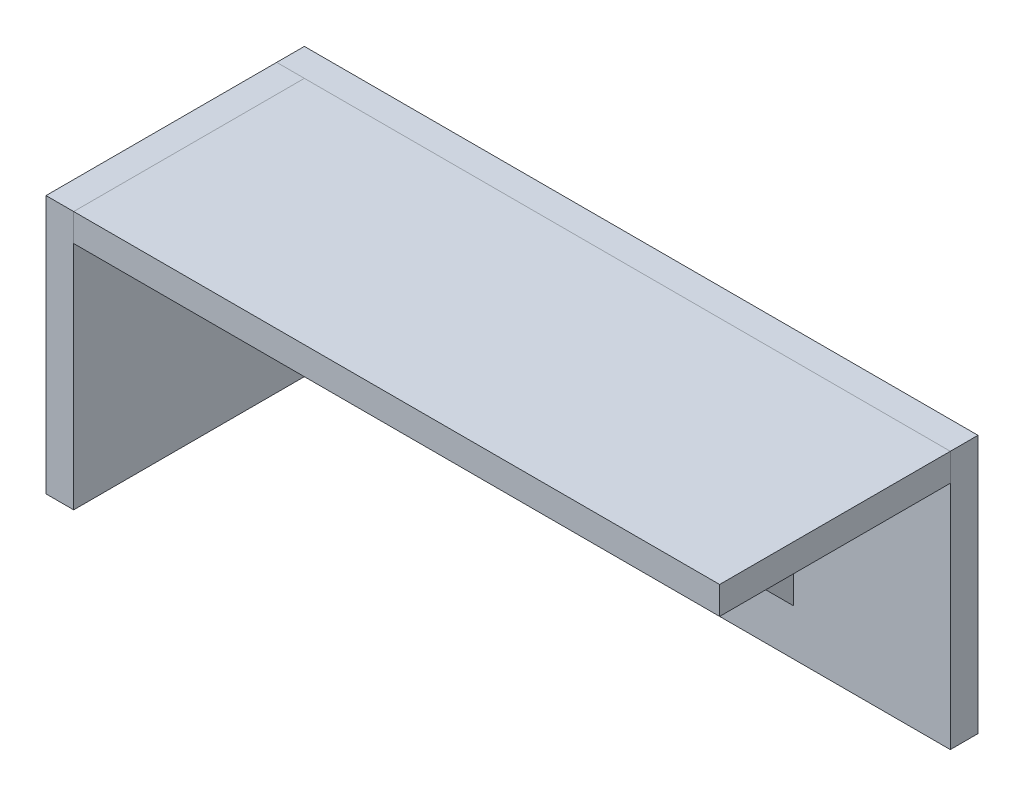
ISO-10303-21;
HEADER;
FILE_DESCRIPTION(('STEP AP214'),'2;1');
FILE_NAME('part.step','',(''),(''),'','','');
FILE_SCHEMA(('AUTOMOTIVE_DESIGN { 1 0 10303 214 1 1 1 1 }'));
ENDSEC;
DATA;
#1=APPLICATION_CONTEXT('core data for automotive mechanical design processes');
#2=APPLICATION_PROTOCOL_DEFINITION('international standard','automotive_design',2000,#1);
#3=PRODUCT_CONTEXT('',#1,'mechanical');
#4=PRODUCT('Part','Part','',(#3));
#5=PRODUCT_RELATED_PRODUCT_CATEGORY('part','',(#4));
#6=PRODUCT_DEFINITION_FORMATION('','',#4);
#7=PRODUCT_DEFINITION_CONTEXT('part definition',#1,'design');
#8=PRODUCT_DEFINITION('design','',#6,#7);
#9=PRODUCT_DEFINITION_SHAPE('','',#8);
#10=(LENGTH_UNIT() NAMED_UNIT(*) SI_UNIT(.MILLI.,.METRE.));
#11=(NAMED_UNIT(*) PLANE_ANGLE_UNIT() SI_UNIT($,.RADIAN.));
#12=(NAMED_UNIT(*) SI_UNIT($,.STERADIAN.) SOLID_ANGLE_UNIT());
#13=UNCERTAINTY_MEASURE_WITH_UNIT(LENGTH_MEASURE(1.E-05),#10,'distance_accuracy_value','');
#14=(GEOMETRIC_REPRESENTATION_CONTEXT(3) GLOBAL_UNCERTAINTY_ASSIGNED_CONTEXT((#13)) GLOBAL_UNIT_ASSIGNED_CONTEXT((#10,
#11,#12)) REPRESENTATION_CONTEXT('',''));
#15=CARTESIAN_POINT('',(0.,0.,0.));
#16=DIRECTION('',(0.,0.,1.));
#17=DIRECTION('',(1.,0.,0.));
#18=AXIS2_PLACEMENT_3D('',#15,#16,#17);
#19=CARTESIAN_POINT('',(-0.499999999999989,13.5,0.));
#20=DIRECTION('',(0.,-1.,0.));
#21=DIRECTION('',(0.,0.,-1.));
#22=AXIS2_PLACEMENT_3D('',#19,#20,#21);
#23=PLANE('',#22);
#24=DIRECTION('',(0.,0.,1.));
#25=VECTOR('',#24,1.);
#26=CARTESIAN_POINT('',(-3.49999999999999,13.5,0.));
#27=LINE('',#26,#25);
#28=CARTESIAN_POINT('',(-3.49999999999999,13.5,0.));
#29=VERTEX_POINT('',#28);
#30=CARTESIAN_POINT('',(-3.49999999999999,13.5,20.));
#31=VERTEX_POINT('',#30);
#32=EDGE_CURVE('E100',#29,#31,#27,.T.);
#33=ORIENTED_EDGE('',*,*,#32,.T.);
#34=DIRECTION('',(-1.,0.,0.));
#35=VECTOR('',#34,1.);
#36=CARTESIAN_POINT('',(-0.499999999999989,13.5,20.));
#37=LINE('',#36,#35);
#38=CARTESIAN_POINT('',(-0.499999999999989,13.5,20.));
#39=VERTEX_POINT('',#38);
#40=EDGE_CURVE('E12',#39,#31,#37,.T.);
#41=ORIENTED_EDGE('',*,*,#40,.F.);
#42=DIRECTION('',(0.,0.,1.));
#43=VECTOR('',#42,1.);
#44=CARTESIAN_POINT('',(-0.499999999999989,13.5,0.));
#45=LINE('',#44,#43);
#46=CARTESIAN_POINT('',(-0.499999999999989,13.5,0.));
#47=VERTEX_POINT('',#46);
#48=EDGE_CURVE('E93',#47,#39,#45,.T.);
#49=ORIENTED_EDGE('',*,*,#48,.F.);
#50=DIRECTION('',(-1.,0.,0.));
#51=VECTOR('',#50,1.);
#52=CARTESIAN_POINT('',(-0.499999999999989,13.5,0.));
#53=LINE('',#52,#51);
#54=EDGE_CURVE('E101',#47,#29,#53,.T.);
#55=ORIENTED_EDGE('',*,*,#54,.T.);
#56=EDGE_LOOP('',(#33,#41,#49,#55));
#57=FACE_BOUND('',#56,.T.);
#58=ADVANCED_FACE('F53',(#57),#23,.F.);
#59=CARTESIAN_POINT('',(-0.499999999999989,13.5,20.));
#60=DIRECTION('',(0.,0.707106781186547,-0.707106781186548));
#61=DIRECTION('',(0.,0.707106781186548,0.707106781186547));
#62=AXIS2_PLACEMENT_3D('',#59,#60,#61);
#63=PLANE('',#62);
#64=DIRECTION('',(0.,-0.707106781186548,-0.707106781186547));
#65=VECTOR('',#64,1.);
#66=CARTESIAN_POINT('',(-3.49999999999999,13.5,20.));
#67=LINE('',#66,#65);
#68=CARTESIAN_POINT('',(-3.49999999999999,-6.5,0.));
#69=VERTEX_POINT('',#68);
#70=EDGE_CURVE('E81',#31,#69,#67,.T.);
#71=ORIENTED_EDGE('',*,*,#70,.T.);
#72=DIRECTION('',(-1.,0.,0.));
#73=VECTOR('',#72,1.);
#74=CARTESIAN_POINT('',(-0.499999999999989,-6.5,0.));
#75=LINE('',#74,#73);
#76=CARTESIAN_POINT('',(-0.499999999999989,-6.5,0.));
#77=VERTEX_POINT('',#76);
#78=EDGE_CURVE('E61',#77,#69,#75,.T.);
#79=ORIENTED_EDGE('',*,*,#78,.F.);
#80=DIRECTION('',(0.,-0.707106781186548,-0.707106781186547));
#81=VECTOR('',#80,1.);
#82=CARTESIAN_POINT('',(-0.499999999999989,13.5,20.));
#83=LINE('',#82,#81);
#84=EDGE_CURVE('E89',#39,#77,#83,.T.);
#85=ORIENTED_EDGE('',*,*,#84,.F.);
#86=ORIENTED_EDGE('',*,*,#40,.T.);
#87=EDGE_LOOP('',(#71,#79,#85,#86));
#88=FACE_BOUND('',#87,.T.);
#89=ADVANCED_FACE('F90',(#88),#63,.F.);
#90=CARTESIAN_POINT('',(-0.499999999999989,-6.5,0.));
#91=DIRECTION('',(0.,0.,1.));
#92=DIRECTION('',(0.,-1.,0.));
#93=AXIS2_PLACEMENT_3D('',#90,#91,#92);
#94=PLANE('',#93);
#95=DIRECTION('',(0.,1.,0.));
#96=VECTOR('',#95,1.);
#97=CARTESIAN_POINT('',(-3.49999999999999,-6.5,0.));
#98=LINE('',#97,#96);
#99=EDGE_CURVE('E86',#69,#29,#98,.T.);
#100=ORIENTED_EDGE('',*,*,#99,.T.);
#101=ORIENTED_EDGE('',*,*,#54,.F.);
#102=DIRECTION('',(0.,1.,0.));
#103=VECTOR('',#102,1.);
#104=CARTESIAN_POINT('',(-0.499999999999989,-6.5,0.));
#105=LINE('',#104,#103);
#106=EDGE_CURVE('E69',#77,#47,#105,.T.);
#107=ORIENTED_EDGE('',*,*,#106,.F.);
#108=ORIENTED_EDGE('',*,*,#78,.T.);
#109=EDGE_LOOP('',(#100,#101,#107,#108));
#110=FACE_BOUND('',#109,.T.);
#111=ADVANCED_FACE('F108',(#110),#94,.F.);
#112=CARTESIAN_POINT('',(-0.499999999999989,0.,0.));
#113=DIRECTION('',(-1.,0.,0.));
#114=DIRECTION('',(0.,0.,1.));
#115=AXIS2_PLACEMENT_3D('',#112,#113,#114);
#116=PLANE('',#115);
#117=ORIENTED_EDGE('',*,*,#48,.T.);
#118=ORIENTED_EDGE('',*,*,#84,.T.);
#119=ORIENTED_EDGE('',*,*,#106,.T.);
#120=EDGE_LOOP('',(#117,#118,#119));
#121=FACE_BOUND('',#120,.T.);
#122=ADVANCED_FACE('F96',(#121),#116,.F.);
#123=CARTESIAN_POINT('',(-3.49999999999999,0.,0.));
#124=DIRECTION('',(-1.,0.,0.));
#125=DIRECTION('',(0.,0.,1.));
#126=AXIS2_PLACEMENT_3D('',#123,#124,#125);
#127=PLANE('',#126);
#128=ORIENTED_EDGE('',*,*,#32,.F.);
#129=ORIENTED_EDGE('',*,*,#99,.F.);
#130=ORIENTED_EDGE('',*,*,#70,.F.);
#131=EDGE_LOOP('',(#128,#129,#130));
#132=FACE_BOUND('',#131,.T.);
#133=ADVANCED_FACE('F109',(#132),#127,.T.);
#134=CLOSED_SHELL('',(#58,#89,#111,#122,#133));
#135=MANIFOLD_SOLID_BREP('B2',#134);
#136=CARTESIAN_POINT('',(-30.5,13.5,0.));
#137=DIRECTION('',(0.,-1.,0.));
#138=DIRECTION('',(0.,0.,-1.));
#139=AXIS2_PLACEMENT_3D('',#136,#137,#138);
#140=PLANE('',#139);
#141=DIRECTION('',(0.,0.,1.));
#142=VECTOR('',#141,1.);
#143=CARTESIAN_POINT('',(-33.5,13.5,0.));
#144=LINE('',#143,#142);
#145=CARTESIAN_POINT('',(-33.5,13.5,0.));
#146=VERTEX_POINT('',#145);
#147=CARTESIAN_POINT('',(-33.5,13.5,20.));
#148=VERTEX_POINT('',#147);
#149=EDGE_CURVE('E213',#146,#148,#144,.T.);
#150=ORIENTED_EDGE('',*,*,#149,.T.);
#151=DIRECTION('',(-1.,0.,0.));
#152=VECTOR('',#151,1.);
#153=CARTESIAN_POINT('',(-30.5,13.5,20.));
#154=LINE('',#153,#152);
#155=CARTESIAN_POINT('',(-30.5,13.5,20.));
#156=VERTEX_POINT('',#155);
#157=EDGE_CURVE('E51',#156,#148,#154,.T.);
#158=ORIENTED_EDGE('',*,*,#157,.F.);
#159=DIRECTION('',(0.,0.,1.));
#160=VECTOR('',#159,1.);
#161=CARTESIAN_POINT('',(-30.5,13.5,0.));
#162=LINE('',#161,#160);
#163=CARTESIAN_POINT('',(-30.5,13.5,0.));
#164=VERTEX_POINT('',#163);
#165=EDGE_CURVE('E205',#164,#156,#162,.T.);
#166=ORIENTED_EDGE('',*,*,#165,.F.);
#167=DIRECTION('',(-1.,0.,0.));
#168=VECTOR('',#167,1.);
#169=CARTESIAN_POINT('',(-30.5,13.5,0.));
#170=LINE('',#169,#168);
#171=EDGE_CURVE('E214',#164,#146,#170,.T.);
#172=ORIENTED_EDGE('',*,*,#171,.T.);
#173=EDGE_LOOP('',(#150,#158,#166,#172));
#174=FACE_BOUND('',#173,.T.);
#175=ADVANCED_FACE('F164',(#174),#140,.F.);
#176=CARTESIAN_POINT('',(-30.5,13.5,20.));
#177=DIRECTION('',(0.,0.707106781186547,-0.707106781186548));
#178=DIRECTION('',(0.,0.707106781186548,0.707106781186547));
#179=AXIS2_PLACEMENT_3D('',#176,#177,#178);
#180=PLANE('',#179);
#181=DIRECTION('',(0.,-0.707106781186548,-0.707106781186547));
#182=VECTOR('',#181,1.);
#183=CARTESIAN_POINT('',(-33.5,13.5,20.));
#184=LINE('',#183,#182);
#185=CARTESIAN_POINT('',(-33.5,-6.5,0.));
#186=VERTEX_POINT('',#185);
#187=EDGE_CURVE('E192',#148,#186,#184,.T.);
#188=ORIENTED_EDGE('',*,*,#187,.T.);
#189=DIRECTION('',(-1.,0.,0.));
#190=VECTOR('',#189,1.);
#191=CARTESIAN_POINT('',(-30.5,-6.5,0.));
#192=LINE('',#191,#190);
#193=CARTESIAN_POINT('',(-30.5,-6.5,0.));
#194=VERTEX_POINT('',#193);
#195=EDGE_CURVE('E172',#194,#186,#192,.T.);
#196=ORIENTED_EDGE('',*,*,#195,.F.);
#197=DIRECTION('',(0.,-0.707106781186548,-0.707106781186547));
#198=VECTOR('',#197,1.);
#199=CARTESIAN_POINT('',(-30.5,13.5,20.));
#200=LINE('',#199,#198);
#201=EDGE_CURVE('E200',#156,#194,#200,.T.);
#202=ORIENTED_EDGE('',*,*,#201,.F.);
#203=ORIENTED_EDGE('',*,*,#157,.T.);
#204=EDGE_LOOP('',(#188,#196,#202,#203));
#205=FACE_BOUND('',#204,.T.);
#206=ADVANCED_FACE('F201',(#205),#180,.F.);
#207=CARTESIAN_POINT('',(-30.5,-6.5,0.));
#208=DIRECTION('',(0.,0.,1.));
#209=DIRECTION('',(0.,-1.,0.));
#210=AXIS2_PLACEMENT_3D('',#207,#208,#209);
#211=PLANE('',#210);
#212=DIRECTION('',(0.,1.,0.));
#213=VECTOR('',#212,1.);
#214=CARTESIAN_POINT('',(-33.5,-6.5,0.));
#215=LINE('',#214,#213);
#216=EDGE_CURVE('E197',#186,#146,#215,.T.);
#217=ORIENTED_EDGE('',*,*,#216,.T.);
#218=ORIENTED_EDGE('',*,*,#171,.F.);
#219=DIRECTION('',(0.,1.,0.));
#220=VECTOR('',#219,1.);
#221=CARTESIAN_POINT('',(-30.5,-6.5,0.));
#222=LINE('',#221,#220);
#223=EDGE_CURVE('E180',#194,#164,#222,.T.);
#224=ORIENTED_EDGE('',*,*,#223,.F.);
#225=ORIENTED_EDGE('',*,*,#195,.T.);
#226=EDGE_LOOP('',(#217,#218,#224,#225));
#227=FACE_BOUND('',#226,.T.);
#228=ADVANCED_FACE('F221',(#227),#211,.F.);
#229=CARTESIAN_POINT('',(-30.5,0.,0.));
#230=DIRECTION('',(-1.,0.,0.));
#231=DIRECTION('',(0.,0.,1.));
#232=AXIS2_PLACEMENT_3D('',#229,#230,#231);
#233=PLANE('',#232);
#234=ORIENTED_EDGE('',*,*,#165,.T.);
#235=ORIENTED_EDGE('',*,*,#201,.T.);
#236=ORIENTED_EDGE('',*,*,#223,.T.);
#237=EDGE_LOOP('',(#234,#235,#236));
#238=FACE_BOUND('',#237,.T.);
#239=ADVANCED_FACE('F208',(#238),#233,.F.);
#240=CARTESIAN_POINT('',(-33.5,0.,0.));
#241=DIRECTION('',(-1.,0.,0.));
#242=DIRECTION('',(0.,0.,1.));
#243=AXIS2_PLACEMENT_3D('',#240,#241,#242);
#244=PLANE('',#243);
#245=ORIENTED_EDGE('',*,*,#149,.F.);
#246=ORIENTED_EDGE('',*,*,#216,.F.);
#247=ORIENTED_EDGE('',*,*,#187,.F.);
#248=EDGE_LOOP('',(#245,#246,#247));
#249=FACE_BOUND('',#248,.T.);
#250=ADVANCED_FACE('F222',(#249),#244,.T.);
#251=CLOSED_SHELL('',(#175,#206,#228,#239,#250));
#252=MANIFOLD_SOLID_BREP('B6',#251);
#253=CARTESIAN_POINT('',(-53.5,16.5,25.));
#254=DIRECTION('',(0.,0.,-1.));
#255=DIRECTION('',(0.,1.,0.));
#256=AXIS2_PLACEMENT_3D('',#253,#254,#255);
#257=PLANE('',#256);
#258=DIRECTION('',(0.,-1.,0.));
#259=VECTOR('',#258,1.);
#260=CARTESIAN_POINT('',(-56.5,16.5,25.));
#261=LINE('',#260,#259);
#262=CARTESIAN_POINT('',(-56.5,16.5,25.));
#263=VERTEX_POINT('',#262);
#264=CARTESIAN_POINT('',(-56.5,-11.5,25.));
#265=VERTEX_POINT('',#264);
#266=EDGE_CURVE('E344',#263,#265,#261,.T.);
#267=ORIENTED_EDGE('',*,*,#266,.T.);
#268=DIRECTION('',(-1.,0.,0.));
#269=VECTOR('',#268,1.);
#270=CARTESIAN_POINT('',(-53.5,-11.5,25.));
#271=LINE('',#270,#269);
#272=CARTESIAN_POINT('',(-53.5,-11.5,25.));
#273=VERTEX_POINT('',#272);
#274=EDGE_CURVE('E162',#273,#265,#271,.T.);
#275=ORIENTED_EDGE('',*,*,#274,.F.);
#276=DIRECTION('',(0.,-1.,0.));
#277=VECTOR('',#276,1.);
#278=CARTESIAN_POINT('',(-53.5,16.5,25.));
#279=LINE('',#278,#277);
#280=CARTESIAN_POINT('',(-53.5,16.5,25.));
#281=VERTEX_POINT('',#280);
#282=EDGE_CURVE('E332',#281,#273,#279,.T.);
#283=ORIENTED_EDGE('',*,*,#282,.F.);
#284=DIRECTION('',(-1.,0.,0.));
#285=VECTOR('',#284,1.);
#286=CARTESIAN_POINT('',(-53.5,16.5,25.));
#287=LINE('',#286,#285);
#288=EDGE_CURVE('E340',#281,#263,#287,.T.);
#289=ORIENTED_EDGE('',*,*,#288,.T.);
#290=EDGE_LOOP('',(#267,#275,#283,#289));
#291=FACE_BOUND('',#290,.T.);
#292=ADVANCED_FACE('F281',(#291),#257,.F.);
#293=CARTESIAN_POINT('',(-53.5,-11.5,-3.));
#294=DIRECTION('',(0.,1.,0.));
#295=DIRECTION('',(-1.,0.,0.));
#296=AXIS2_PLACEMENT_3D('',#293,#294,#295);
#297=PLANE('',#296);
#298=DIRECTION('',(0.,0.,-1.));
#299=VECTOR('',#298,1.);
#300=CARTESIAN_POINT('',(-56.5,-11.5,-3.));
#301=LINE('',#300,#299);
#302=CARTESIAN_POINT('',(-56.5,-11.5,0.));
#303=VERTEX_POINT('',#302);
#304=EDGE_CURVE('E336',#265,#303,#301,.T.);
#305=ORIENTED_EDGE('',*,*,#304,.T.);
#306=DIRECTION('',(-1.,0.,0.));
#307=VECTOR('',#306,1.);
#308=CARTESIAN_POINT('',(-53.5,-11.5,0.));
#309=LINE('',#308,#307);
#310=CARTESIAN_POINT('',(-53.5,-11.5,0.));
#311=VERTEX_POINT('',#310);
#312=EDGE_CURVE('E289',#311,#303,#309,.T.);
#313=ORIENTED_EDGE('',*,*,#312,.F.);
#314=DIRECTION('',(0.,0.,-1.));
#315=VECTOR('',#314,1.);
#316=CARTESIAN_POINT('',(-53.5,-11.5,-3.));
#317=LINE('',#316,#315);
#318=EDGE_CURVE('E327',#273,#311,#317,.T.);
#319=ORIENTED_EDGE('',*,*,#318,.F.);
#320=ORIENTED_EDGE('',*,*,#274,.T.);
#321=EDGE_LOOP('',(#305,#313,#319,#320));
#322=FACE_BOUND('',#321,.T.);
#323=ADVANCED_FACE('F335',(#322),#297,.F.);
#324=CARTESIAN_POINT('',(-53.5,16.5,0.));
#325=DIRECTION('',(0.,0.,1.));
#326=DIRECTION('',(0.,-1.,0.));
#327=AXIS2_PLACEMENT_3D('',#324,#325,#326);
#328=PLANE('',#327);
#329=DIRECTION('',(0.,1.,0.));
#330=VECTOR('',#329,1.);
#331=CARTESIAN_POINT('',(-56.5,16.5,0.));
#332=LINE('',#331,#330);
#333=CARTESIAN_POINT('',(-56.5,16.5,0.));
#334=VERTEX_POINT('',#333);
#335=EDGE_CURVE('E314',#303,#334,#332,.T.);
#336=ORIENTED_EDGE('',*,*,#335,.T.);
#337=DIRECTION('',(-1.,0.,0.));
#338=VECTOR('',#337,1.);
#339=CARTESIAN_POINT('',(-53.5,16.5,0.));
#340=LINE('',#339,#338);
#341=CARTESIAN_POINT('',(-53.5,16.5,0.));
#342=VERTEX_POINT('',#341);
#343=EDGE_CURVE('E337',#342,#334,#340,.T.);
#344=ORIENTED_EDGE('',*,*,#343,.F.);
#345=DIRECTION('',(0.,1.,0.));
#346=VECTOR('',#345,1.);
#347=CARTESIAN_POINT('',(-53.5,16.5,0.));
#348=LINE('',#347,#346);
#349=EDGE_CURVE('E330',#311,#342,#348,.T.);
#350=ORIENTED_EDGE('',*,*,#349,.F.);
#351=ORIENTED_EDGE('',*,*,#312,.T.);
#352=EDGE_LOOP('',(#336,#344,#350,#351));
#353=FACE_BOUND('',#352,.T.);
#354=ADVANCED_FACE('F338',(#353),#328,.F.);
#355=CARTESIAN_POINT('',(-53.5,16.5,-3.));
#356=DIRECTION('',(0.,-1.,0.));
#357=DIRECTION('',(1.,0.,0.));
#358=AXIS2_PLACEMENT_3D('',#355,#356,#357);
#359=PLANE('',#358);
#360=DIRECTION('',(0.,0.,1.));
#361=VECTOR('',#360,1.);
#362=CARTESIAN_POINT('',(-56.5,16.5,-3.));
#363=LINE('',#362,#361);
#364=EDGE_CURVE('E320',#334,#263,#363,.T.);
#365=ORIENTED_EDGE('',*,*,#364,.T.);
#366=ORIENTED_EDGE('',*,*,#288,.F.);
#367=DIRECTION('',(0.,0.,1.));
#368=VECTOR('',#367,1.);
#369=CARTESIAN_POINT('',(-53.5,16.5,-3.));
#370=LINE('',#369,#368);
#371=EDGE_CURVE('E297',#342,#281,#370,.T.);
#372=ORIENTED_EDGE('',*,*,#371,.F.);
#373=ORIENTED_EDGE('',*,*,#343,.T.);
#374=EDGE_LOOP('',(#365,#366,#372,#373));
#375=FACE_BOUND('',#374,.T.);
#376=ADVANCED_FACE('F358',(#375),#359,.F.);
#377=CARTESIAN_POINT('',(-53.5,0.,0.));
#378=DIRECTION('',(1.,0.,0.));
#379=DIRECTION('',(0.,0.,-1.));
#380=AXIS2_PLACEMENT_3D('',#377,#378,#379);
#381=PLANE('',#380);
#382=ORIENTED_EDGE('',*,*,#282,.T.);
#383=ORIENTED_EDGE('',*,*,#318,.T.);
#384=ORIENTED_EDGE('',*,*,#349,.T.);
#385=ORIENTED_EDGE('',*,*,#371,.T.);
#386=EDGE_LOOP('',(#382,#383,#384,#385));
#387=FACE_BOUND('',#386,.T.);
#388=ADVANCED_FACE('F328',(#387),#381,.T.);
#389=CARTESIAN_POINT('',(-56.5,0.,0.));
#390=DIRECTION('',(1.,0.,0.));
#391=DIRECTION('',(0.,0.,-1.));
#392=AXIS2_PLACEMENT_3D('',#389,#390,#391);
#393=PLANE('',#392);
#394=ORIENTED_EDGE('',*,*,#266,.F.);
#395=ORIENTED_EDGE('',*,*,#364,.F.);
#396=ORIENTED_EDGE('',*,*,#335,.F.);
#397=ORIENTED_EDGE('',*,*,#304,.F.);
#398=EDGE_LOOP('',(#394,#395,#396,#397));
#399=FACE_BOUND('',#398,.T.);
#400=ADVANCED_FACE('F361',(#399),#393,.F.);
#401=CLOSED_SHELL('',(#292,#323,#354,#376,#388,#400));
#402=MANIFOLD_SOLID_BREP('B45',#401);
#403=CARTESIAN_POINT('',(-53.5,13.5,0.));
#404=DIRECTION('',(-1.,0.,0.));
#405=DIRECTION('',(0.,-1.,0.));
#406=AXIS2_PLACEMENT_3D('',#403,#404,#405);
#407=PLANE('',#406);
#408=DIRECTION('',(0.,0.,1.));
#409=VECTOR('',#408,1.);
#410=CARTESIAN_POINT('',(-53.5,16.5,0.));
#411=LINE('',#410,#409);
#412=CARTESIAN_POINT('',(-53.5,16.5,0.));
#413=VERTEX_POINT('',#412);
#414=CARTESIAN_POINT('',(-53.5,16.5,25.));
#415=VERTEX_POINT('',#414);
#416=EDGE_CURVE('E489',#413,#415,#411,.T.);
#417=ORIENTED_EDGE('',*,*,#416,.F.);
#418=DIRECTION('',(0.,1.,0.));
#419=VECTOR('',#418,1.);
#420=CARTESIAN_POINT('',(-53.5,13.5,0.));
#421=LINE('',#420,#419);
#422=CARTESIAN_POINT('',(-53.5,13.5,0.));
#423=VERTEX_POINT('',#422);
#424=EDGE_CURVE('E279',#423,#413,#421,.T.);
#425=ORIENTED_EDGE('',*,*,#424,.F.);
#426=DIRECTION('',(0.,0.,1.));
#427=VECTOR('',#426,1.);
#428=CARTESIAN_POINT('',(-53.5,13.5,0.));
#429=LINE('',#428,#427);
#430=CARTESIAN_POINT('',(-53.5,13.5,25.));
#431=VERTEX_POINT('',#430);
#432=EDGE_CURVE('E483',#423,#431,#429,.T.);
#433=ORIENTED_EDGE('',*,*,#432,.T.);
#434=DIRECTION('',(0.,1.,0.));
#435=VECTOR('',#434,1.);
#436=CARTESIAN_POINT('',(-53.5,13.5,25.));
#437=LINE('',#436,#435);
#438=EDGE_CURVE('E428',#431,#415,#437,.T.);
#439=ORIENTED_EDGE('',*,*,#438,.T.);
#440=EDGE_LOOP('',(#417,#425,#433,#439));
#441=FACE_BOUND('',#440,.T.);
#442=ADVANCED_FACE('F425',(#441),#407,.T.);
#443=CARTESIAN_POINT('',(-53.5,13.5,0.));
#444=DIRECTION('',(0.,0.,-1.));
#445=DIRECTION('',(-1.,0.,0.));
#446=AXIS2_PLACEMENT_3D('',#443,#444,#445);
#447=PLANE('',#446);
#448=DIRECTION('',(-1.,0.,0.));
#449=VECTOR('',#448,1.);
#450=CARTESIAN_POINT('',(-53.5,16.5,0.));
#451=LINE('',#450,#449);
#452=CARTESIAN_POINT('',(16.5,16.5,0.));
#453=VERTEX_POINT('',#452);
#454=EDGE_CURVE('E485',#453,#413,#451,.T.);
#455=ORIENTED_EDGE('',*,*,#454,.F.);
#456=DIRECTION('',(0.,1.,0.));
#457=VECTOR('',#456,1.);
#458=CARTESIAN_POINT('',(16.5,13.5,0.));
#459=LINE('',#458,#457);
#460=CARTESIAN_POINT('',(16.5,13.5,0.));
#461=VERTEX_POINT('',#460);
#462=EDGE_CURVE('E434',#461,#453,#459,.T.);
#463=ORIENTED_EDGE('',*,*,#462,.F.);
#464=DIRECTION('',(-1.,0.,0.));
#465=VECTOR('',#464,1.);
#466=CARTESIAN_POINT('',(-53.5,13.5,0.));
#467=LINE('',#466,#465);
#468=EDGE_CURVE('E480',#461,#423,#467,.T.);
#469=ORIENTED_EDGE('',*,*,#468,.T.);
#470=ORIENTED_EDGE('',*,*,#424,.T.);
#471=EDGE_LOOP('',(#455,#463,#469,#470));
#472=FACE_BOUND('',#471,.T.);
#473=ADVANCED_FACE('F507',(#472),#447,.T.);
#474=CARTESIAN_POINT('',(16.5,13.5,0.));
#475=DIRECTION('',(1.,0.,0.));
#476=DIRECTION('',(0.,0.,-1.));
#477=AXIS2_PLACEMENT_3D('',#474,#475,#476);
#478=PLANE('',#477);
#479=DIRECTION('',(0.,0.,-1.));
#480=VECTOR('',#479,1.);
#481=CARTESIAN_POINT('',(16.5,16.5,0.));
#482=LINE('',#481,#480);
#483=CARTESIAN_POINT('',(16.5,16.5,25.));
#484=VERTEX_POINT('',#483);
#485=EDGE_CURVE('E475',#484,#453,#482,.T.);
#486=ORIENTED_EDGE('',*,*,#485,.F.);
#487=DIRECTION('',(0.,1.,0.));
#488=VECTOR('',#487,1.);
#489=CARTESIAN_POINT('',(16.5,13.5,25.));
#490=LINE('',#489,#488);
#491=CARTESIAN_POINT('',(16.5,13.5,25.));
#492=VERTEX_POINT('',#491);
#493=EDGE_CURVE('E470',#492,#484,#490,.T.);
#494=ORIENTED_EDGE('',*,*,#493,.F.);
#495=DIRECTION('',(0.,0.,-1.));
#496=VECTOR('',#495,1.);
#497=CARTESIAN_POINT('',(16.5,13.5,0.));
#498=LINE('',#497,#496);
#499=EDGE_CURVE('E473',#492,#461,#498,.T.);
#500=ORIENTED_EDGE('',*,*,#499,.T.);
#501=ORIENTED_EDGE('',*,*,#462,.T.);
#502=EDGE_LOOP('',(#486,#494,#500,#501));
#503=FACE_BOUND('',#502,.T.);
#504=ADVANCED_FACE('F472',(#503),#478,.T.);
#505=CARTESIAN_POINT('',(-53.5,13.5,25.));
#506=DIRECTION('',(0.,0.,1.));
#507=DIRECTION('',(1.,0.,0.));
#508=AXIS2_PLACEMENT_3D('',#505,#506,#507);
#509=PLANE('',#508);
#510=DIRECTION('',(1.,0.,0.));
#511=VECTOR('',#510,1.);
#512=CARTESIAN_POINT('',(-53.5,16.5,25.));
#513=LINE('',#512,#511);
#514=EDGE_CURVE('E494',#415,#484,#513,.T.);
#515=ORIENTED_EDGE('',*,*,#514,.F.);
#516=ORIENTED_EDGE('',*,*,#438,.F.);
#517=DIRECTION('',(1.,0.,0.));
#518=VECTOR('',#517,1.);
#519=CARTESIAN_POINT('',(-53.5,13.5,25.));
#520=LINE('',#519,#518);
#521=EDGE_CURVE('E479',#431,#492,#520,.T.);
#522=ORIENTED_EDGE('',*,*,#521,.T.);
#523=ORIENTED_EDGE('',*,*,#493,.T.);
#524=EDGE_LOOP('',(#515,#516,#522,#523));
#525=FACE_BOUND('',#524,.T.);
#526=ADVANCED_FACE('F482',(#525),#509,.T.);
#527=CARTESIAN_POINT('',(0.,13.5,0.));
#528=DIRECTION('',(0.,1.,0.));
#529=DIRECTION('',(-1.,0.,0.));
#530=AXIS2_PLACEMENT_3D('',#527,#528,#529);
#531=PLANE('',#530);
#532=ORIENTED_EDGE('',*,*,#432,.F.);
#533=ORIENTED_EDGE('',*,*,#468,.F.);
#534=ORIENTED_EDGE('',*,*,#499,.F.);
#535=ORIENTED_EDGE('',*,*,#521,.F.);
#536=EDGE_LOOP('',(#532,#533,#534,#535));
#537=FACE_BOUND('',#536,.T.);
#538=ADVANCED_FACE('F478',(#537),#531,.F.);
#539=CARTESIAN_POINT('',(0.,16.5,0.));
#540=DIRECTION('',(0.,1.,0.));
#541=DIRECTION('',(-1.,0.,0.));
#542=AXIS2_PLACEMENT_3D('',#539,#540,#541);
#543=PLANE('',#542);
#544=ORIENTED_EDGE('',*,*,#416,.T.);
#545=ORIENTED_EDGE('',*,*,#514,.T.);
#546=ORIENTED_EDGE('',*,*,#485,.T.);
#547=ORIENTED_EDGE('',*,*,#454,.T.);
#548=EDGE_LOOP('',(#544,#545,#546,#547));
#549=FACE_BOUND('',#548,.T.);
#550=ADVANCED_FACE('F506',(#549),#543,.T.);
#551=CLOSED_SHELL('',(#442,#473,#504,#526,#538,#550));
#552=MANIFOLD_SOLID_BREP('B156',#551);
#553=CARTESIAN_POINT('',(-56.5,16.5,-3.));
#554=DIRECTION('',(-1.,0.,0.));
#555=DIRECTION('',(0.,0.,1.));
#556=AXIS2_PLACEMENT_3D('',#553,#554,#555);
#557=PLANE('',#556);
#558=DIRECTION('',(0.,-1.,0.));
#559=VECTOR('',#558,1.);
#560=CARTESIAN_POINT('',(-56.5,16.5,0.));
#561=LINE('',#560,#559);
#562=CARTESIAN_POINT('',(-56.5,16.5,0.));
#563=VERTEX_POINT('',#562);
#564=CARTESIAN_POINT('',(-56.5,-11.5,0.));
#565=VERTEX_POINT('',#564);
#566=EDGE_CURVE('E628',#563,#565,#561,.T.);
#567=ORIENTED_EDGE('',*,*,#566,.F.);
#568=DIRECTION('',(0.,0.,1.));
#569=VECTOR('',#568,1.);
#570=CARTESIAN_POINT('',(-56.5,16.5,-3.));
#571=LINE('',#570,#569);
#572=CARTESIAN_POINT('',(-56.5,16.5,-3.));
#573=VERTEX_POINT('',#572);
#574=EDGE_CURVE('E423',#573,#563,#571,.T.);
#575=ORIENTED_EDGE('',*,*,#574,.F.);
#576=DIRECTION('',(0.,-1.,0.));
#577=VECTOR('',#576,1.);
#578=CARTESIAN_POINT('',(-56.5,16.5,-3.));
#579=LINE('',#578,#577);
#580=CARTESIAN_POINT('',(-56.5,-11.5,-3.));
#581=VERTEX_POINT('',#580);
#582=EDGE_CURVE('E620',#573,#581,#579,.T.);
#583=ORIENTED_EDGE('',*,*,#582,.T.);
#584=DIRECTION('',(0.,0.,1.));
#585=VECTOR('',#584,1.);
#586=CARTESIAN_POINT('',(-56.5,-11.5,-3.));
#587=LINE('',#586,#585);
#588=EDGE_CURVE('E561',#581,#565,#587,.T.);
#589=ORIENTED_EDGE('',*,*,#588,.T.);
#590=EDGE_LOOP('',(#567,#575,#583,#589));
#591=FACE_BOUND('',#590,.T.);
#592=ADVANCED_FACE('F558',(#591),#557,.T.);
#593=CARTESIAN_POINT('',(-56.5,16.5,-3.));
#594=DIRECTION('',(0.,1.,0.));
#595=DIRECTION('',(-1.,0.,0.));
#596=AXIS2_PLACEMENT_3D('',#593,#594,#595);
#597=PLANE('',#596);
#598=DIRECTION('',(-1.,0.,0.));
#599=VECTOR('',#598,1.);
#600=CARTESIAN_POINT('',(-56.5,16.5,0.));
#601=LINE('',#600,#599);
#602=CARTESIAN_POINT('',(16.5,16.5,0.));
#603=VERTEX_POINT('',#602);
#604=EDGE_CURVE('E623',#603,#563,#601,.T.);
#605=ORIENTED_EDGE('',*,*,#604,.F.);
#606=DIRECTION('',(0.,0.,1.));
#607=VECTOR('',#606,1.);
#608=CARTESIAN_POINT('',(16.5,16.5,-3.));
#609=LINE('',#608,#607);
#610=CARTESIAN_POINT('',(16.5,16.5,-3.));
#611=VERTEX_POINT('',#610);
#612=EDGE_CURVE('E568',#611,#603,#609,.T.);
#613=ORIENTED_EDGE('',*,*,#612,.F.);
#614=DIRECTION('',(-1.,0.,0.));
#615=VECTOR('',#614,1.);
#616=CARTESIAN_POINT('',(-56.5,16.5,-3.));
#617=LINE('',#616,#615);
#618=EDGE_CURVE('E615',#611,#573,#617,.T.);
#619=ORIENTED_EDGE('',*,*,#618,.T.);
#620=ORIENTED_EDGE('',*,*,#574,.T.);
#621=EDGE_LOOP('',(#605,#613,#619,#620));
#622=FACE_BOUND('',#621,.T.);
#623=ADVANCED_FACE('F644',(#622),#597,.T.);
#624=CARTESIAN_POINT('',(16.5,16.5,-3.));
#625=DIRECTION('',(1.,0.,0.));
#626=DIRECTION('',(0.,1.,0.));
#627=AXIS2_PLACEMENT_3D('',#624,#625,#626);
#628=PLANE('',#627);
#629=DIRECTION('',(0.,1.,0.));
#630=VECTOR('',#629,1.);
#631=CARTESIAN_POINT('',(16.5,16.5,0.));
#632=LINE('',#631,#630);
#633=CARTESIAN_POINT('',(16.5,-11.5,0.));
#634=VERTEX_POINT('',#633);
#635=EDGE_CURVE('E609',#634,#603,#632,.T.);
#636=ORIENTED_EDGE('',*,*,#635,.F.);
#637=DIRECTION('',(0.,0.,1.));
#638=VECTOR('',#637,1.);
#639=CARTESIAN_POINT('',(16.5,-11.5,-3.));
#640=LINE('',#639,#638);
#641=CARTESIAN_POINT('',(16.5,-11.5,-3.));
#642=VERTEX_POINT('',#641);
#643=EDGE_CURVE('E604',#642,#634,#640,.T.);
#644=ORIENTED_EDGE('',*,*,#643,.F.);
#645=DIRECTION('',(0.,1.,0.));
#646=VECTOR('',#645,1.);
#647=CARTESIAN_POINT('',(16.5,16.5,-3.));
#648=LINE('',#647,#646);
#649=EDGE_CURVE('E607',#642,#611,#648,.T.);
#650=ORIENTED_EDGE('',*,*,#649,.T.);
#651=ORIENTED_EDGE('',*,*,#612,.T.);
#652=EDGE_LOOP('',(#636,#644,#650,#651));
#653=FACE_BOUND('',#652,.T.);
#654=ADVANCED_FACE('F606',(#653),#628,.T.);
#655=CARTESIAN_POINT('',(-56.5,-11.5,-3.));
#656=DIRECTION('',(0.,-1.,0.));
#657=DIRECTION('',(0.,0.,-1.));
#658=AXIS2_PLACEMENT_3D('',#655,#656,#657);
#659=PLANE('',#658);
#660=DIRECTION('',(1.,0.,0.));
#661=VECTOR('',#660,1.);
#662=CARTESIAN_POINT('',(-56.5,-11.5,0.));
#663=LINE('',#662,#661);
#664=EDGE_CURVE('E632',#565,#634,#663,.T.);
#665=ORIENTED_EDGE('',*,*,#664,.F.);
#666=ORIENTED_EDGE('',*,*,#588,.F.);
#667=DIRECTION('',(1.,0.,0.));
#668=VECTOR('',#667,1.);
#669=CARTESIAN_POINT('',(-56.5,-11.5,-3.));
#670=LINE('',#669,#668);
#671=EDGE_CURVE('E614',#581,#642,#670,.T.);
#672=ORIENTED_EDGE('',*,*,#671,.T.);
#673=ORIENTED_EDGE('',*,*,#643,.T.);
#674=EDGE_LOOP('',(#665,#666,#672,#673));
#675=FACE_BOUND('',#674,.T.);
#676=ADVANCED_FACE('F618',(#675),#659,.T.);
#677=CARTESIAN_POINT('',(0.,0.,-3.));
#678=DIRECTION('',(0.,0.,1.));
#679=DIRECTION('',(1.,0.,0.));
#680=AXIS2_PLACEMENT_3D('',#677,#678,#679);
#681=PLANE('',#680);
#682=ORIENTED_EDGE('',*,*,#582,.F.);
#683=ORIENTED_EDGE('',*,*,#618,.F.);
#684=ORIENTED_EDGE('',*,*,#649,.F.);
#685=ORIENTED_EDGE('',*,*,#671,.F.);
#686=EDGE_LOOP('',(#682,#683,#684,#685));
#687=FACE_BOUND('',#686,.T.);
#688=ADVANCED_FACE('F613',(#687),#681,.F.);
#689=CARTESIAN_POINT('',(0.,0.,0.));
#690=DIRECTION('',(0.,0.,1.));
#691=DIRECTION('',(1.,0.,0.));
#692=AXIS2_PLACEMENT_3D('',#689,#690,#691);
#693=PLANE('',#692);
#694=ORIENTED_EDGE('',*,*,#566,.T.);
#695=ORIENTED_EDGE('',*,*,#664,.T.);
#696=ORIENTED_EDGE('',*,*,#635,.T.);
#697=ORIENTED_EDGE('',*,*,#604,.T.);
#698=EDGE_LOOP('',(#694,#695,#696,#697));
#699=FACE_BOUND('',#698,.T.);
#700=ADVANCED_FACE('F643',(#699),#693,.T.);
#701=CLOSED_SHELL('',(#592,#623,#654,#676,#688,#700));
#702=MANIFOLD_SOLID_BREP('B273',#701);
#703=ADVANCED_BREP_SHAPE_REPRESENTATION('',(#18,#135,#252,#402,#552,#702),#14);
#704=SHAPE_DEFINITION_REPRESENTATION(#9,#703);
ENDSEC;
END-ISO-10303-21;
